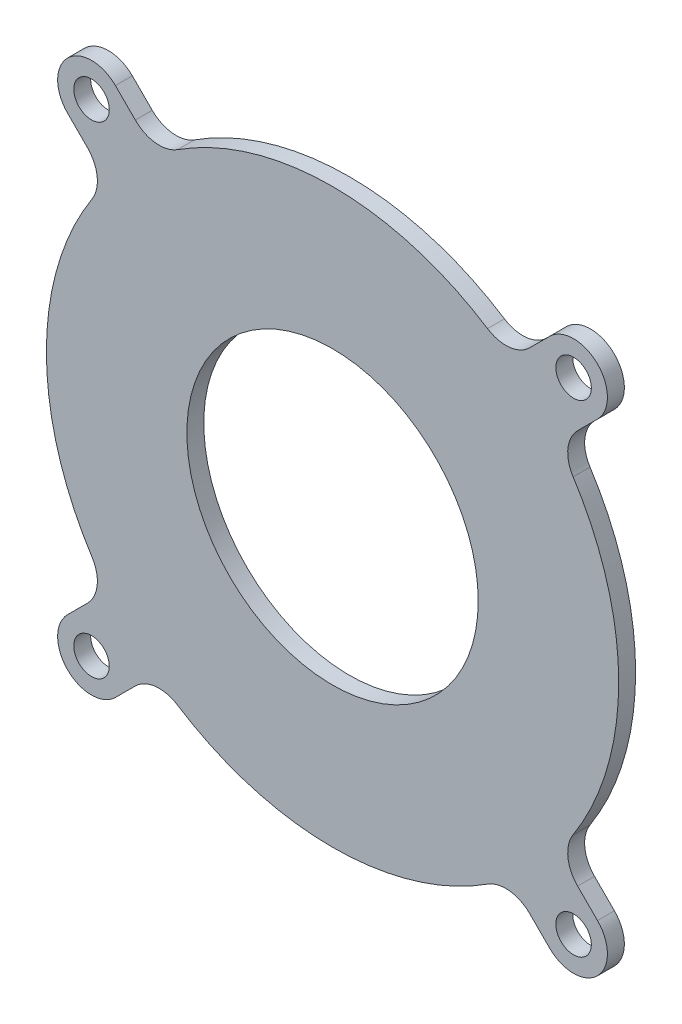
ISO-10303-21;
HEADER;
FILE_DESCRIPTION(('STEP AP214'),'2;1');
FILE_NAME('part.step','',(''),(''),'','','');
FILE_SCHEMA(('AUTOMOTIVE_DESIGN { 1 0 10303 214 1 1 1 1 }'));
ENDSEC;
DATA;
#1=APPLICATION_CONTEXT('core data for automotive mechanical design processes');
#2=APPLICATION_PROTOCOL_DEFINITION('international standard','automotive_design',2000,#1);
#3=PRODUCT_CONTEXT('',#1,'mechanical');
#4=PRODUCT('Part','Part','',(#3));
#5=PRODUCT_RELATED_PRODUCT_CATEGORY('part','',(#4));
#6=PRODUCT_DEFINITION_FORMATION('','',#4);
#7=PRODUCT_DEFINITION_CONTEXT('part definition',#1,'design');
#8=PRODUCT_DEFINITION('design','',#6,#7);
#9=PRODUCT_DEFINITION_SHAPE('','',#8);
#10=(LENGTH_UNIT() NAMED_UNIT(*) SI_UNIT(.MILLI.,.METRE.));
#11=(NAMED_UNIT(*) PLANE_ANGLE_UNIT() SI_UNIT($,.RADIAN.));
#12=(NAMED_UNIT(*) SI_UNIT($,.STERADIAN.) SOLID_ANGLE_UNIT());
#13=UNCERTAINTY_MEASURE_WITH_UNIT(LENGTH_MEASURE(1.E-05),#10,'distance_accuracy_value','');
#14=(GEOMETRIC_REPRESENTATION_CONTEXT(3) GLOBAL_UNCERTAINTY_ASSIGNED_CONTEXT((#13)) GLOBAL_UNIT_ASSIGNED_CONTEXT((#10,
#11,#12)) REPRESENTATION_CONTEXT('',''));
#15=CARTESIAN_POINT('',(0.,0.,0.));
#16=DIRECTION('',(0.,0.,1.));
#17=DIRECTION('',(1.,0.,0.));
#18=AXIS2_PLACEMENT_3D('',#15,#16,#17);
#19=CARTESIAN_POINT('',(52.049747468308,-52.0497474683077,2.));
#20=DIRECTION('',(0.,0.,1.));
#21=DIRECTION('',(1.,0.,0.));
#22=AXIS2_PLACEMENT_3D('',#19,#20,#21);
#23=PLANE('',#22);
#24=CARTESIAN_POINT('',(-4.94974746830807,4.94974746830784,2.));
#25=DIRECTION('',(0.,0.,1.));
#26=DIRECTION('',(1.,0.,0.));
#27=AXIS2_PLACEMENT_3D('',#24,#25,#26);
#28=CIRCLE('',#27,2.10000000000181);
#29=CARTESIAN_POINT('',(-2.84974746830626,4.94974746830784,2.));
#30=VERTEX_POINT('',#29);
#31=EDGE_CURVE('E528',#30,#30,#28,.T.);
#32=ORIENTED_EDGE('',*,*,#31,.F.);
#33=EDGE_LOOP('',(#32));
#34=FACE_BOUND('',#33,.T.);
#35=CARTESIAN_POINT('',(52.049747468308,-52.0497474683077,2.));
#36=DIRECTION('',(0.,0.,1.));
#37=DIRECTION('',(1.,0.,0.));
#38=AXIS2_PLACEMENT_3D('',#35,#36,#37);
#39=CIRCLE('',#38,2.0999999999985);
#40=CARTESIAN_POINT('',(54.1497474683065,-52.0497474683077,2.));
#41=VERTEX_POINT('',#40);
#42=EDGE_CURVE('E544',#41,#41,#39,.T.);
#43=ORIENTED_EDGE('',*,*,#42,.F.);
#44=EDGE_LOOP('',(#43));
#45=FACE_BOUND('',#44,.T.);
#46=CARTESIAN_POINT('',(52.049747468308,-52.0497474683077,2.));
#47=DIRECTION('',(0.,0.,1.));
#48=DIRECTION('',(1.,0.,0.));
#49=AXIS2_PLACEMENT_3D('',#46,#47,#48);
#50=CIRCLE('',#49,3.99999999998963);
#51=CARTESIAN_POINT('',(49.2213203435691,-54.8781745930466,2.));
#52=VERTEX_POINT('',#51);
#53=CARTESIAN_POINT('',(54.8781745930468,-49.2213203435689,2.));
#54=VERTEX_POINT('',#53);
#55=EDGE_CURVE('E308',#52,#54,#50,.T.);
#56=ORIENTED_EDGE('',*,*,#55,.T.);
#57=DIRECTION('',(-0.707106781186531,0.707106781186564,0.));
#58=VECTOR('',#57,1.);
#59=CARTESIAN_POINT('',(54.8781745930468,-49.2213203435689,2.));
#60=LINE('',#59,#58);
#61=CARTESIAN_POINT('',(52.526918716007,-46.870064466529,2.));
#62=VERTEX_POINT('',#61);
#63=EDGE_CURVE('E148',#54,#62,#60,.T.);
#64=ORIENTED_EDGE('',*,*,#63,.T.);
#65=CARTESIAN_POINT('',(55.3553458407532,-44.0416373417828,2.));
#66=DIRECTION('',(0.,0.,-1.));
#67=DIRECTION('',(1.,0.,0.));
#68=AXIS2_PLACEMENT_3D('',#65,#66,#67);
#69=CIRCLE('',#68,3.99999999999999);
#70=CARTESIAN_POINT('',(51.9928142334286,-41.8752160554806,2.));
#71=VERTEX_POINT('',#70);
#72=EDGE_CURVE('E393',#62,#71,#69,.T.);
#73=ORIENTED_EDGE('',*,*,#72,.T.);
#74=CARTESIAN_POINT('',(23.5499999999334,-23.5499999999476,2.));
#75=DIRECTION('',(0.,0.,1.));
#76=DIRECTION('',(1.,0.,0.));
#77=AXIS2_PLACEMENT_3D('',#74,#75,#76);
#78=CIRCLE('',#77,33.8350000000456);
#79=CARTESIAN_POINT('',(51.9928142335033,-5.22478394453042,2.));
#80=VERTEX_POINT('',#79);
#81=EDGE_CURVE('E413',#71,#80,#78,.T.);
#82=ORIENTED_EDGE('',*,*,#81,.T.);
#83=CARTESIAN_POINT('',(55.3553458408367,-3.05836265824198,2.));
#84=DIRECTION('',(0.,0.,-1.));
#85=DIRECTION('',(1.,0.,0.));
#86=AXIS2_PLACEMENT_3D('',#83,#84,#85);
#87=CIRCLE('',#86,4.);
#88=CARTESIAN_POINT('',(52.5269187160905,-0.22993553349579,2.));
#89=VERTEX_POINT('',#88);
#90=EDGE_CURVE('E409',#80,#89,#87,.T.);
#91=ORIENTED_EDGE('',*,*,#90,.T.);
#92=DIRECTION('',(0.707106781186545,0.70710678118655,0.));
#93=VECTOR('',#92,1.);
#94=CARTESIAN_POINT('',(54.8781745931514,2.12132034356506,2.));
#95=LINE('',#94,#93);
#96=CARTESIAN_POINT('',(54.8781745931516,2.12132034356488,2.));
#97=VERTEX_POINT('',#96);
#98=EDGE_CURVE('E412',#89,#97,#95,.T.);
#99=ORIENTED_EDGE('',*,*,#98,.T.);
#100=CARTESIAN_POINT('',(52.0497474684125,4.94974746830361,2.));
#101=DIRECTION('',(0.,0.,1.));
#102=DIRECTION('',(1.,0.,0.));
#103=AXIS2_PLACEMENT_3D('',#100,#101,#102);
#104=CIRCLE('',#103,3.99999999998965);
#105=CARTESIAN_POINT('',(49.2213203436736,7.7781745930428,2.));
#106=VERTEX_POINT('',#105);
#107=EDGE_CURVE('E417',#97,#106,#104,.T.);
#108=ORIENTED_EDGE('',*,*,#107,.T.);
#109=DIRECTION('',(-0.707106781186542,-0.707106781186553,0.));
#110=VECTOR('',#109,1.);
#111=CARTESIAN_POINT('',(49.2213203436736,7.7781745930428,2.));
#112=LINE('',#111,#110);
#113=CARTESIAN_POINT('',(46.8700644666735,5.42691871604261,2.));
#114=VERTEX_POINT('',#113);
#115=EDGE_CURVE('E424',#106,#114,#112,.T.);
#116=ORIENTED_EDGE('',*,*,#115,.T.);
#117=CARTESIAN_POINT('',(44.0416373419273,8.2553458407888,2.));
#118=DIRECTION('',(0.,0.,-1.));
#119=DIRECTION('',(1.,0.,0.));
#120=AXIS2_PLACEMENT_3D('',#117,#118,#119);
#121=CIRCLE('',#120,3.99999999999999);
#122=CARTESIAN_POINT('',(41.875216055624,4.89281423346494,2.));
#123=VERTEX_POINT('',#122);
#124=EDGE_CURVE('E427',#114,#123,#121,.T.);
#125=ORIENTED_EDGE('',*,*,#124,.T.);
#126=CARTESIAN_POINT('',(23.5500000000813,-23.5500000000242,2.));
#127=DIRECTION('',(0.,0.,1.));
#128=DIRECTION('',(-1.,0.,0.));
#129=AXIS2_PLACEMENT_3D('',#126,#127,#128);
#130=CIRCLE('',#129,33.8350000000457);
#131=CARTESIAN_POINT('',(5.22478394462314,4.8928142335194,2.));
#132=VERTEX_POINT('',#131);
#133=EDGE_CURVE('E430',#123,#132,#130,.T.);
#134=ORIENTED_EDGE('',*,*,#133,.T.);
#135=CARTESIAN_POINT('',(3.05836265832984,8.2553458408497,2.));
#136=DIRECTION('',(0.,0.,-1.));
#137=DIRECTION('',(1.,0.,0.));
#138=AXIS2_PLACEMENT_3D('',#135,#136,#137);
#139=CIRCLE('',#138,4.);
#140=CARTESIAN_POINT('',(0.229935533583649,5.42691871610351,2.));
#141=VERTEX_POINT('',#140);
#142=EDGE_CURVE('E433',#132,#141,#139,.T.);
#143=ORIENTED_EDGE('',*,*,#142,.T.);
#144=DIRECTION('',(-0.707106781186566,0.707106781186529,0.));
#145=VECTOR('',#144,1.);
#146=CARTESIAN_POINT('',(-2.12132034346029,7.77817459314733,2.));
#147=LINE('',#146,#145);
#148=CARTESIAN_POINT('',(-2.12132034346029,7.77817459314732,2.));
#149=VERTEX_POINT('',#148);
#150=EDGE_CURVE('E436',#141,#149,#147,.T.);
#151=ORIENTED_EDGE('',*,*,#150,.T.);
#152=CARTESIAN_POINT('',(-4.94974746819915,4.94974746840844,2.));
#153=DIRECTION('',(0.,0.,1.));
#154=DIRECTION('',(1.,0.,0.));
#155=AXIS2_PLACEMENT_3D('',#152,#153,#154);
#156=CIRCLE('',#155,3.99999999998964);
#157=CARTESIAN_POINT('',(-7.77817459293803,2.1213203436696,2.));
#158=VERTEX_POINT('',#157);
#159=EDGE_CURVE('E439',#149,#158,#156,.T.);
#160=ORIENTED_EDGE('',*,*,#159,.T.);
#161=DIRECTION('',(0.707106781186545,-0.70710678118655,0.));
#162=VECTOR('',#161,1.);
#163=CARTESIAN_POINT('',(-7.77817459293803,2.1213203436696,2.));
#164=LINE('',#163,#162);
#165=CARTESIAN_POINT('',(-5.42691871592922,-0.229935533339226,2.));
#166=VERTEX_POINT('',#165);
#167=EDGE_CURVE('E442',#158,#166,#164,.T.);
#168=ORIENTED_EDGE('',*,*,#167,.T.);
#169=CARTESIAN_POINT('',(-8.25534584067542,-3.05836265808541,2.));
#170=DIRECTION('',(0.,0.,-1.));
#171=DIRECTION('',(1.,0.,0.));
#172=AXIS2_PLACEMENT_3D('',#169,#170,#171);
#173=CIRCLE('',#172,4.);
#174=CARTESIAN_POINT('',(-4.89281423335789,-5.22478394439853,2.));
#175=VERTEX_POINT('',#174);
#176=EDGE_CURVE('E445',#166,#175,#173,.T.);
#177=ORIENTED_EDGE('',*,*,#176,.T.);
#178=CARTESIAN_POINT('',(23.55000000004,-23.5500000000001,2.));
#179=DIRECTION('',(0.,0.,1.));
#180=DIRECTION('',(1.,0.,0.));
#181=AXIS2_PLACEMENT_3D('',#178,#179,#180);
#182=CIRCLE('',#181,33.8350000000009);
#183=CARTESIAN_POINT('',(-4.89281423346648,-41.8752160554331,2.));
#184=VERTEX_POINT('',#183);
#185=EDGE_CURVE('E448',#175,#184,#182,.T.);
#186=ORIENTED_EDGE('',*,*,#185,.T.);
#187=CARTESIAN_POINT('',(-8.25534584079685,-44.0416373417262,2.));
#188=DIRECTION('',(0.,0.,-1.));
#189=DIRECTION('',(1.,0.,0.));
#190=AXIS2_PLACEMENT_3D('',#187,#188,#189);
#191=CIRCLE('',#190,4.);
#192=CARTESIAN_POINT('',(-5.42691871605065,-46.8700644664724,2.));
#193=VERTEX_POINT('',#192);
#194=EDGE_CURVE('E451',#184,#193,#191,.T.);
#195=ORIENTED_EDGE('',*,*,#194,.T.);
#196=DIRECTION('',(-0.707106781186544,-0.707106781186551,0.));
#197=VECTOR('',#196,1.);
#198=CARTESIAN_POINT('',(-7.77817459304254,-49.2213203434643,2.));
#199=LINE('',#198,#197);
#200=CARTESIAN_POINT('',(-7.77817459304274,-49.2213203434641,2.));
#201=VERTEX_POINT('',#200);
#202=EDGE_CURVE('E454',#193,#201,#199,.T.);
#203=ORIENTED_EDGE('',*,*,#202,.T.);
#204=CARTESIAN_POINT('',(-4.94974746830362,-52.0497474682028,2.));
#205=DIRECTION('',(0.,0.,1.));
#206=DIRECTION('',(1.,0.,0.));
#207=AXIS2_PLACEMENT_3D('',#204,#205,#206);
#208=CIRCLE('',#207,3.99999999998964);
#209=CARTESIAN_POINT('',(-2.1213203435648,-54.8781745929421,2.));
#210=VERTEX_POINT('',#209);
#211=EDGE_CURVE('E457',#201,#210,#208,.T.);
#212=ORIENTED_EDGE('',*,*,#211,.T.);
#213=DIRECTION('',(0.707106781186544,0.707106781186551,0.));
#214=VECTOR('',#213,1.);
#215=CARTESIAN_POINT('',(-2.1213203435648,-54.8781745929421,2.));
#216=LINE('',#215,#214);
#217=CARTESIAN_POINT('',(0.229935533390949,-52.5269187159863,2.));
#218=VERTEX_POINT('',#217);
#219=EDGE_CURVE('E460',#210,#218,#216,.T.);
#220=ORIENTED_EDGE('',*,*,#219,.T.);
#221=CARTESIAN_POINT('',(3.05836265813714,-55.3553458407325,2.));
#222=DIRECTION('',(0.,0.,-1.));
#223=DIRECTION('',(1.,0.,0.));
#224=AXIS2_PLACEMENT_3D('',#221,#222,#223);
#225=CIRCLE('',#224,3.99999999999999);
#226=CARTESIAN_POINT('',(5.22478394444227,-51.9928142334098,2.));
#227=VERTEX_POINT('',#226);
#228=EDGE_CURVE('E215',#218,#227,#225,.T.);
#229=ORIENTED_EDGE('',*,*,#228,.T.);
#230=CARTESIAN_POINT('',(23.5499999999759,-23.5499999999693,2.));
#231=DIRECTION('',(0.,0.,1.));
#232=DIRECTION('',(1.,0.,0.));
#233=AXIS2_PLACEMENT_3D('',#230,#231,#232);
#234=CIRCLE('',#233,33.8349999999999);
#235=CARTESIAN_POINT('',(41.8752160554813,-51.992814233428,2.));
#236=VERTEX_POINT('',#235);
#237=EDGE_CURVE('E209',#227,#236,#234,.T.);
#238=ORIENTED_EDGE('',*,*,#237,.T.);
#239=CARTESIAN_POINT('',(44.0416373417831,-55.3553458407528,2.));
#240=DIRECTION('',(0.,0.,-1.));
#241=DIRECTION('',(1.,0.,0.));
#242=AXIS2_PLACEMENT_3D('',#239,#240,#241);
#243=CIRCLE('',#242,4.);
#244=CARTESIAN_POINT('',(46.8700644665293,-52.5269187160066,2.));
#245=VERTEX_POINT('',#244);
#246=EDGE_CURVE('E213',#236,#245,#243,.T.);
#247=ORIENTED_EDGE('',*,*,#246,.T.);
#248=DIRECTION('',(0.707106781186534,-0.707106781186561,0.));
#249=VECTOR('',#248,1.);
#250=CARTESIAN_POINT('',(49.2213203435691,-54.8781745930466,2.));
#251=LINE('',#250,#249);
#252=EDGE_CURVE('E57',#245,#52,#251,.T.);
#253=ORIENTED_EDGE('',*,*,#252,.T.);
#254=EDGE_LOOP('',(#56,#64,#73,#82,#91,#99,#108,#116,#125,#134,#143,#151,#160,#168,#177,#186,
#195,#203,#212,#220,#229,#238,#247,#253));
#255=FACE_BOUND('',#254,.T.);
#256=CARTESIAN_POINT('',(23.5500000000813,-23.5500000000242,2.));
#257=DIRECTION('',(0.,0.,1.));
#258=DIRECTION('',(1.,0.,0.));
#259=AXIS2_PLACEMENT_3D('',#256,#257,#258);
#260=CIRCLE('',#259,17.225);
#261=CARTESIAN_POINT('',(40.7750000000813,-23.5500000000242,2.));
#262=VERTEX_POINT('',#261);
#263=EDGE_CURVE('E242',#262,#262,#260,.T.);
#264=ORIENTED_EDGE('',*,*,#263,.F.);
#265=EDGE_LOOP('',(#264));
#266=FACE_BOUND('',#265,.T.);
#267=CARTESIAN_POINT('',(-4.94974746830785,-52.0497474683081,2.));
#268=DIRECTION('',(0.,0.,1.));
#269=DIRECTION('',(1.,0.,0.));
#270=AXIS2_PLACEMENT_3D('',#267,#268,#269);
#271=CIRCLE('',#270,2.10000000000254);
#272=CARTESIAN_POINT('',(-2.84974746830531,-52.0497474683081,2.));
#273=VERTEX_POINT('',#272);
#274=EDGE_CURVE('E536',#273,#273,#271,.T.);
#275=ORIENTED_EDGE('',*,*,#274,.F.);
#276=EDGE_LOOP('',(#275));
#277=FACE_BOUND('',#276,.T.);
#278=CARTESIAN_POINT('',(52.0497474683079,4.94974746830806,2.));
#279=DIRECTION('',(0.,0.,1.));
#280=DIRECTION('',(1.,0.,0.));
#281=AXIS2_PLACEMENT_3D('',#278,#279,#280);
#282=CIRCLE('',#281,2.09999999999761);
#283=CARTESIAN_POINT('',(54.1497474683055,4.94974746830806,2.));
#284=VERTEX_POINT('',#283);
#285=EDGE_CURVE('E517',#284,#284,#282,.T.);
#286=ORIENTED_EDGE('',*,*,#285,.F.);
#287=EDGE_LOOP('',(#286));
#288=FACE_BOUND('',#287,.T.);
#289=ADVANCED_FACE('F39',(#34,#45,#255,#266,#277,#288),#23,.T.);
#290=CARTESIAN_POINT('',(52.049747468308,-52.0497474683077,0.));
#291=DIRECTION('',(0.,0.,1.));
#292=DIRECTION('',(1.,0.,0.));
#293=AXIS2_PLACEMENT_3D('',#290,#291,#292);
#294=PLANE('',#293);
#295=CARTESIAN_POINT('',(52.049747468308,-52.0497474683077,0.));
#296=DIRECTION('',(0.,0.,1.));
#297=DIRECTION('',(1.,0.,0.));
#298=AXIS2_PLACEMENT_3D('',#295,#296,#297);
#299=CIRCLE('',#298,3.99999999998963);
#300=CARTESIAN_POINT('',(49.2213203435691,-54.8781745930466,0.));
#301=VERTEX_POINT('',#300);
#302=CARTESIAN_POINT('',(54.8781745930468,-49.2213203435689,0.));
#303=VERTEX_POINT('',#302);
#304=EDGE_CURVE('E237',#301,#303,#299,.T.);
#305=ORIENTED_EDGE('',*,*,#304,.F.);
#306=DIRECTION('',(0.707106781186534,-0.707106781186561,0.));
#307=VECTOR('',#306,1.);
#308=CARTESIAN_POINT('',(49.2213203435691,-54.8781745930466,0.));
#309=LINE('',#308,#307);
#310=CARTESIAN_POINT('',(46.8700644665293,-52.5269187160066,0.));
#311=VERTEX_POINT('',#310);
#312=EDGE_CURVE('E140',#311,#301,#309,.T.);
#313=ORIENTED_EDGE('',*,*,#312,.F.);
#314=CARTESIAN_POINT('',(44.0416373417831,-55.3553458407528,0.));
#315=DIRECTION('',(0.,0.,-1.));
#316=DIRECTION('',(1.,0.,0.));
#317=AXIS2_PLACEMENT_3D('',#314,#315,#316);
#318=CIRCLE('',#317,4.);
#319=CARTESIAN_POINT('',(41.8752160554813,-51.992814233428,0.));
#320=VERTEX_POINT('',#319);
#321=EDGE_CURVE('E134',#320,#311,#318,.T.);
#322=ORIENTED_EDGE('',*,*,#321,.F.);
#323=CARTESIAN_POINT('',(23.5499999999759,-23.5499999999693,0.));
#324=DIRECTION('',(0.,0.,1.));
#325=DIRECTION('',(1.,0.,0.));
#326=AXIS2_PLACEMENT_3D('',#323,#324,#325);
#327=CIRCLE('',#326,33.8349999999999);
#328=CARTESIAN_POINT('',(5.22478394444227,-51.9928142334098,0.));
#329=VERTEX_POINT('',#328);
#330=EDGE_CURVE('E224',#329,#320,#327,.T.);
#331=ORIENTED_EDGE('',*,*,#330,.F.);
#332=CARTESIAN_POINT('',(3.05836265813714,-55.3553458407325,0.));
#333=DIRECTION('',(0.,0.,-1.));
#334=DIRECTION('',(1.,0.,0.));
#335=AXIS2_PLACEMENT_3D('',#332,#333,#334);
#336=CIRCLE('',#335,3.99999999999999);
#337=CARTESIAN_POINT('',(0.229935533390949,-52.5269187159863,0.));
#338=VERTEX_POINT('',#337);
#339=EDGE_CURVE('E299',#338,#329,#336,.T.);
#340=ORIENTED_EDGE('',*,*,#339,.F.);
#341=DIRECTION('',(0.707106781186544,0.707106781186551,0.));
#342=VECTOR('',#341,1.);
#343=CARTESIAN_POINT('',(-2.1213203435648,-54.8781745929421,0.));
#344=LINE('',#343,#342);
#345=CARTESIAN_POINT('',(-2.1213203435648,-54.8781745929421,0.));
#346=VERTEX_POINT('',#345);
#347=EDGE_CURVE('E296',#346,#338,#344,.T.);
#348=ORIENTED_EDGE('',*,*,#347,.F.);
#349=CARTESIAN_POINT('',(-4.94974746830362,-52.0497474682028,0.));
#350=DIRECTION('',(0.,0.,1.));
#351=DIRECTION('',(1.,0.,0.));
#352=AXIS2_PLACEMENT_3D('',#349,#350,#351);
#353=CIRCLE('',#352,3.99999999998964);
#354=CARTESIAN_POINT('',(-7.77817459304274,-49.2213203434641,0.));
#355=VERTEX_POINT('',#354);
#356=EDGE_CURVE('E293',#355,#346,#353,.T.);
#357=ORIENTED_EDGE('',*,*,#356,.F.);
#358=DIRECTION('',(-0.707106781186544,-0.707106781186551,0.));
#359=VECTOR('',#358,1.);
#360=CARTESIAN_POINT('',(-7.77817459304254,-49.2213203434643,0.));
#361=LINE('',#360,#359);
#362=CARTESIAN_POINT('',(-5.42691871605065,-46.8700644664724,0.));
#363=VERTEX_POINT('',#362);
#364=EDGE_CURVE('E290',#363,#355,#361,.T.);
#365=ORIENTED_EDGE('',*,*,#364,.F.);
#366=CARTESIAN_POINT('',(-8.25534584079685,-44.0416373417262,0.));
#367=DIRECTION('',(0.,0.,-1.));
#368=DIRECTION('',(1.,0.,0.));
#369=AXIS2_PLACEMENT_3D('',#366,#367,#368);
#370=CIRCLE('',#369,4.);
#371=CARTESIAN_POINT('',(-4.89281423346648,-41.8752160554331,0.));
#372=VERTEX_POINT('',#371);
#373=EDGE_CURVE('E287',#372,#363,#370,.T.);
#374=ORIENTED_EDGE('',*,*,#373,.F.);
#375=CARTESIAN_POINT('',(23.55000000004,-23.5500000000001,0.));
#376=DIRECTION('',(0.,0.,1.));
#377=DIRECTION('',(1.,0.,0.));
#378=AXIS2_PLACEMENT_3D('',#375,#376,#377);
#379=CIRCLE('',#378,33.8350000000009);
#380=CARTESIAN_POINT('',(-4.89281423335789,-5.22478394439853,0.));
#381=VERTEX_POINT('',#380);
#382=EDGE_CURVE('E284',#381,#372,#379,.T.);
#383=ORIENTED_EDGE('',*,*,#382,.F.);
#384=CARTESIAN_POINT('',(-8.25534584067542,-3.05836265808541,0.));
#385=DIRECTION('',(0.,0.,-1.));
#386=DIRECTION('',(1.,0.,0.));
#387=AXIS2_PLACEMENT_3D('',#384,#385,#386);
#388=CIRCLE('',#387,4.);
#389=CARTESIAN_POINT('',(-5.42691871592922,-0.229935533339226,0.));
#390=VERTEX_POINT('',#389);
#391=EDGE_CURVE('E281',#390,#381,#388,.T.);
#392=ORIENTED_EDGE('',*,*,#391,.F.);
#393=DIRECTION('',(0.707106781186545,-0.70710678118655,0.));
#394=VECTOR('',#393,1.);
#395=CARTESIAN_POINT('',(-7.77817459293803,2.1213203436696,0.));
#396=LINE('',#395,#394);
#397=CARTESIAN_POINT('',(-7.77817459293803,2.1213203436696,0.));
#398=VERTEX_POINT('',#397);
#399=EDGE_CURVE('E278',#398,#390,#396,.T.);
#400=ORIENTED_EDGE('',*,*,#399,.F.);
#401=CARTESIAN_POINT('',(-4.94974746819915,4.94974746840844,0.));
#402=DIRECTION('',(0.,0.,1.));
#403=DIRECTION('',(1.,0.,0.));
#404=AXIS2_PLACEMENT_3D('',#401,#402,#403);
#405=CIRCLE('',#404,3.99999999998964);
#406=CARTESIAN_POINT('',(-2.12132034346029,7.77817459314732,0.));
#407=VERTEX_POINT('',#406);
#408=EDGE_CURVE('E275',#407,#398,#405,.T.);
#409=ORIENTED_EDGE('',*,*,#408,.F.);
#410=DIRECTION('',(-0.707106781186566,0.707106781186529,0.));
#411=VECTOR('',#410,1.);
#412=CARTESIAN_POINT('',(-2.12132034346029,7.77817459314733,0.));
#413=LINE('',#412,#411);
#414=CARTESIAN_POINT('',(0.229935533583649,5.42691871610351,0.));
#415=VERTEX_POINT('',#414);
#416=EDGE_CURVE('E272',#415,#407,#413,.T.);
#417=ORIENTED_EDGE('',*,*,#416,.F.);
#418=CARTESIAN_POINT('',(3.05836265832984,8.2553458408497,0.));
#419=DIRECTION('',(0.,0.,-1.));
#420=DIRECTION('',(1.,0.,0.));
#421=AXIS2_PLACEMENT_3D('',#418,#419,#420);
#422=CIRCLE('',#421,4.);
#423=CARTESIAN_POINT('',(5.22478394462314,4.8928142335194,0.));
#424=VERTEX_POINT('',#423);
#425=EDGE_CURVE('E269',#424,#415,#422,.T.);
#426=ORIENTED_EDGE('',*,*,#425,.F.);
#427=CARTESIAN_POINT('',(23.5500000000813,-23.5500000000242,0.));
#428=DIRECTION('',(0.,0.,1.));
#429=DIRECTION('',(-1.,0.,0.));
#430=AXIS2_PLACEMENT_3D('',#427,#428,#429);
#431=CIRCLE('',#430,33.8350000000457);
#432=CARTESIAN_POINT('',(41.875216055624,4.89281423346494,0.));
#433=VERTEX_POINT('',#432);
#434=EDGE_CURVE('E266',#433,#424,#431,.T.);
#435=ORIENTED_EDGE('',*,*,#434,.F.);
#436=CARTESIAN_POINT('',(44.0416373419273,8.2553458407888,0.));
#437=DIRECTION('',(0.,0.,-1.));
#438=DIRECTION('',(1.,0.,0.));
#439=AXIS2_PLACEMENT_3D('',#436,#437,#438);
#440=CIRCLE('',#439,3.99999999999999);
#441=CARTESIAN_POINT('',(46.8700644666735,5.42691871604261,0.));
#442=VERTEX_POINT('',#441);
#443=EDGE_CURVE('E263',#442,#433,#440,.T.);
#444=ORIENTED_EDGE('',*,*,#443,.F.);
#445=DIRECTION('',(-0.707106781186542,-0.707106781186553,0.));
#446=VECTOR('',#445,1.);
#447=CARTESIAN_POINT('',(49.2213203436736,7.7781745930428,0.));
#448=LINE('',#447,#446);
#449=CARTESIAN_POINT('',(49.2213203436736,7.7781745930428,0.));
#450=VERTEX_POINT('',#449);
#451=EDGE_CURVE('E260',#450,#442,#448,.T.);
#452=ORIENTED_EDGE('',*,*,#451,.F.);
#453=CARTESIAN_POINT('',(52.0497474684125,4.94974746830361,0.));
#454=DIRECTION('',(0.,0.,1.));
#455=DIRECTION('',(1.,0.,0.));
#456=AXIS2_PLACEMENT_3D('',#453,#454,#455);
#457=CIRCLE('',#456,3.99999999998965);
#458=CARTESIAN_POINT('',(54.8781745931516,2.12132034356488,0.));
#459=VERTEX_POINT('',#458);
#460=EDGE_CURVE('E257',#459,#450,#457,.T.);
#461=ORIENTED_EDGE('',*,*,#460,.F.);
#462=DIRECTION('',(0.707106781186545,0.70710678118655,0.));
#463=VECTOR('',#462,1.);
#464=CARTESIAN_POINT('',(54.8781745931514,2.12132034356506,0.));
#465=LINE('',#464,#463);
#466=CARTESIAN_POINT('',(52.5269187160905,-0.22993553349579,0.));
#467=VERTEX_POINT('',#466);
#468=EDGE_CURVE('E254',#467,#459,#465,.T.);
#469=ORIENTED_EDGE('',*,*,#468,.F.);
#470=CARTESIAN_POINT('',(55.3553458408367,-3.05836265824198,0.));
#471=DIRECTION('',(0.,0.,-1.));
#472=DIRECTION('',(1.,0.,0.));
#473=AXIS2_PLACEMENT_3D('',#470,#471,#472);
#474=CIRCLE('',#473,4.);
#475=CARTESIAN_POINT('',(51.9928142335033,-5.22478394453042,0.));
#476=VERTEX_POINT('',#475);
#477=EDGE_CURVE('E251',#476,#467,#474,.T.);
#478=ORIENTED_EDGE('',*,*,#477,.F.);
#479=CARTESIAN_POINT('',(23.5499999999334,-23.5499999999476,0.));
#480=DIRECTION('',(0.,0.,1.));
#481=DIRECTION('',(1.,0.,0.));
#482=AXIS2_PLACEMENT_3D('',#479,#480,#481);
#483=CIRCLE('',#482,33.8350000000456);
#484=CARTESIAN_POINT('',(51.9928142334286,-41.8752160554806,0.));
#485=VERTEX_POINT('',#484);
#486=EDGE_CURVE('E248',#485,#476,#483,.T.);
#487=ORIENTED_EDGE('',*,*,#486,.F.);
#488=CARTESIAN_POINT('',(55.3553458407532,-44.0416373417828,0.));
#489=DIRECTION('',(0.,0.,-1.));
#490=DIRECTION('',(1.,0.,0.));
#491=AXIS2_PLACEMENT_3D('',#488,#489,#490);
#492=CIRCLE('',#491,3.99999999999999);
#493=CARTESIAN_POINT('',(52.526918716007,-46.870064466529,0.));
#494=VERTEX_POINT('',#493);
#495=EDGE_CURVE('E245',#494,#485,#492,.T.);
#496=ORIENTED_EDGE('',*,*,#495,.F.);
#497=DIRECTION('',(-0.707106781186531,0.707106781186564,0.));
#498=VECTOR('',#497,1.);
#499=CARTESIAN_POINT('',(54.8781745930468,-49.2213203435689,0.));
#500=LINE('',#499,#498);
#501=EDGE_CURVE('E241',#303,#494,#500,.T.);
#502=ORIENTED_EDGE('',*,*,#501,.F.);
#503=EDGE_LOOP('',(#305,#313,#322,#331,#340,#348,#357,#365,#374,#383,#392,#400,#409,#417,#426,
#435,#444,#452,#461,#469,#478,#487,#496,#502));
#504=FACE_BOUND('',#503,.T.);
#505=CARTESIAN_POINT('',(23.5500000000813,-23.5500000000242,0.));
#506=DIRECTION('',(0.,0.,1.));
#507=DIRECTION('',(1.,0.,0.));
#508=AXIS2_PLACEMENT_3D('',#505,#506,#507);
#509=CIRCLE('',#508,17.225);
#510=CARTESIAN_POINT('',(40.7750000000813,-23.5500000000242,0.));
#511=VERTEX_POINT('',#510);
#512=EDGE_CURVE('E548',#511,#511,#509,.T.);
#513=ORIENTED_EDGE('',*,*,#512,.T.);
#514=EDGE_LOOP('',(#513));
#515=FACE_BOUND('',#514,.T.);
#516=CARTESIAN_POINT('',(52.049747468308,-52.0497474683077,0.));
#517=DIRECTION('',(0.,0.,1.));
#518=DIRECTION('',(1.,0.,0.));
#519=AXIS2_PLACEMENT_3D('',#516,#517,#518);
#520=CIRCLE('',#519,2.0999999999985);
#521=CARTESIAN_POINT('',(54.1497474683065,-52.0497474683077,0.));
#522=VERTEX_POINT('',#521);
#523=EDGE_CURVE('E540',#522,#522,#520,.T.);
#524=ORIENTED_EDGE('',*,*,#523,.T.);
#525=EDGE_LOOP('',(#524));
#526=FACE_BOUND('',#525,.T.);
#527=CARTESIAN_POINT('',(-4.94974746830785,-52.0497474683081,0.));
#528=DIRECTION('',(0.,0.,1.));
#529=DIRECTION('',(1.,0.,0.));
#530=AXIS2_PLACEMENT_3D('',#527,#528,#529);
#531=CIRCLE('',#530,2.10000000000254);
#532=CARTESIAN_POINT('',(-2.84974746830531,-52.0497474683081,0.));
#533=VERTEX_POINT('',#532);
#534=EDGE_CURVE('E532',#533,#533,#531,.T.);
#535=ORIENTED_EDGE('',*,*,#534,.T.);
#536=EDGE_LOOP('',(#535));
#537=FACE_BOUND('',#536,.T.);
#538=CARTESIAN_POINT('',(-4.94974746830807,4.94974746830784,0.));
#539=DIRECTION('',(0.,0.,1.));
#540=DIRECTION('',(1.,0.,0.));
#541=AXIS2_PLACEMENT_3D('',#538,#539,#540);
#542=CIRCLE('',#541,2.10000000000181);
#543=CARTESIAN_POINT('',(-2.84974746830626,4.94974746830784,0.));
#544=VERTEX_POINT('',#543);
#545=EDGE_CURVE('E525',#544,#544,#542,.T.);
#546=ORIENTED_EDGE('',*,*,#545,.T.);
#547=EDGE_LOOP('',(#546));
#548=FACE_BOUND('',#547,.T.);
#549=CARTESIAN_POINT('',(52.0497474683079,4.94974746830806,0.));
#550=DIRECTION('',(0.,0.,1.));
#551=DIRECTION('',(1.,0.,0.));
#552=AXIS2_PLACEMENT_3D('',#549,#550,#551);
#553=CIRCLE('',#552,2.09999999999761);
#554=CARTESIAN_POINT('',(54.1497474683055,4.94974746830806,0.));
#555=VERTEX_POINT('',#554);
#556=EDGE_CURVE('E520',#555,#555,#553,.T.);
#557=ORIENTED_EDGE('',*,*,#556,.T.);
#558=EDGE_LOOP('',(#557));
#559=FACE_BOUND('',#558,.T.);
#560=ADVANCED_FACE('F397',(#504,#515,#526,#537,#548,#559),#294,.F.);
#561=CARTESIAN_POINT('',(52.049747468308,-52.0497474683077,2.));
#562=DIRECTION('',(0.,0.,-1.));
#563=DIRECTION('',(-1.,0.,0.));
#564=AXIS2_PLACEMENT_3D('',#561,#562,#563);
#565=CYLINDRICAL_SURFACE('',#564,3.99999999998963);
#566=ORIENTED_EDGE('',*,*,#304,.T.);
#567=DIRECTION('',(0.,0.,-1.));
#568=VECTOR('',#567,1.);
#569=CARTESIAN_POINT('',(54.8781745930468,-49.2213203435689,2.));
#570=LINE('',#569,#568);
#571=EDGE_CURVE('E11',#54,#303,#570,.T.);
#572=ORIENTED_EDGE('',*,*,#571,.F.);
#573=ORIENTED_EDGE('',*,*,#55,.F.);
#574=DIRECTION('',(0.,0.,-1.));
#575=VECTOR('',#574,1.);
#576=CARTESIAN_POINT('',(49.2213203435691,-54.8781745930466,2.));
#577=LINE('',#576,#575);
#578=EDGE_CURVE('E233',#52,#301,#577,.T.);
#579=ORIENTED_EDGE('',*,*,#578,.T.);
#580=EDGE_LOOP('',(#566,#572,#573,#579));
#581=FACE_BOUND('',#580,.T.);
#582=ADVANCED_FACE('F41',(#581),#565,.T.);
#583=CARTESIAN_POINT('',(54.8781745930468,-49.2213203435689,2.));
#584=DIRECTION('',(-0.707106781186564,-0.707106781186531,0.));
#585=DIRECTION('',(0.707106781186531,-0.707106781186564,0.));
#586=AXIS2_PLACEMENT_3D('',#583,#584,#585);
#587=PLANE('',#586);
#588=ORIENTED_EDGE('',*,*,#501,.T.);
#589=DIRECTION('',(0.,0.,-1.));
#590=VECTOR('',#589,1.);
#591=CARTESIAN_POINT('',(52.526918716007,-46.870064466529,2.));
#592=LINE('',#591,#590);
#593=EDGE_CURVE('E49',#62,#494,#592,.T.);
#594=ORIENTED_EDGE('',*,*,#593,.F.);
#595=ORIENTED_EDGE('',*,*,#63,.F.);
#596=ORIENTED_EDGE('',*,*,#571,.T.);
#597=EDGE_LOOP('',(#588,#594,#595,#596));
#598=FACE_BOUND('',#597,.T.);
#599=ADVANCED_FACE('F793',(#598),#587,.F.);
#600=CARTESIAN_POINT('',(55.3553458407532,-44.0416373417828,2.));
#601=DIRECTION('',(0.,0.,-1.));
#602=DIRECTION('',(-1.,0.,0.));
#603=AXIS2_PLACEMENT_3D('',#600,#601,#602);
#604=CYLINDRICAL_SURFACE('',#603,3.99999999999999);
#605=ORIENTED_EDGE('',*,*,#495,.T.);
#606=DIRECTION('',(0.,0.,-1.));
#607=VECTOR('',#606,1.);
#608=CARTESIAN_POINT('',(51.9928142334286,-41.8752160554806,2.));
#609=LINE('',#608,#607);
#610=EDGE_CURVE('E383',#71,#485,#609,.T.);
#611=ORIENTED_EDGE('',*,*,#610,.F.);
#612=ORIENTED_EDGE('',*,*,#72,.F.);
#613=ORIENTED_EDGE('',*,*,#593,.T.);
#614=EDGE_LOOP('',(#605,#611,#612,#613));
#615=FACE_BOUND('',#614,.T.);
#616=ADVANCED_FACE('F391',(#615),#604,.F.);
#617=CARTESIAN_POINT('',(23.5499999999334,-23.5499999999476,2.));
#618=DIRECTION('',(0.,0.,-1.));
#619=DIRECTION('',(-1.,0.,0.));
#620=AXIS2_PLACEMENT_3D('',#617,#618,#619);
#621=CYLINDRICAL_SURFACE('',#620,33.8350000000456);
#622=ORIENTED_EDGE('',*,*,#486,.T.);
#623=DIRECTION('',(0.,0.,-1.));
#624=VECTOR('',#623,1.);
#625=CARTESIAN_POINT('',(51.9928142335033,-5.22478394453042,2.));
#626=LINE('',#625,#624);
#627=EDGE_CURVE('E379',#80,#476,#626,.T.);
#628=ORIENTED_EDGE('',*,*,#627,.F.);
#629=ORIENTED_EDGE('',*,*,#81,.F.);
#630=ORIENTED_EDGE('',*,*,#610,.T.);
#631=EDGE_LOOP('',(#622,#628,#629,#630));
#632=FACE_BOUND('',#631,.T.);
#633=ADVANCED_FACE('F403',(#632),#621,.T.);
#634=CARTESIAN_POINT('',(55.3553458408367,-3.05836265824198,2.));
#635=DIRECTION('',(0.,0.,-1.));
#636=DIRECTION('',(-1.,0.,0.));
#637=AXIS2_PLACEMENT_3D('',#634,#635,#636);
#638=CYLINDRICAL_SURFACE('',#637,4.);
#639=ORIENTED_EDGE('',*,*,#477,.T.);
#640=DIRECTION('',(0.,0.,-1.));
#641=VECTOR('',#640,1.);
#642=CARTESIAN_POINT('',(52.5269187160905,-0.22993553349579,2.));
#643=LINE('',#642,#641);
#644=EDGE_CURVE('E375',#89,#467,#643,.T.);
#645=ORIENTED_EDGE('',*,*,#644,.F.);
#646=ORIENTED_EDGE('',*,*,#90,.F.);
#647=ORIENTED_EDGE('',*,*,#627,.T.);
#648=EDGE_LOOP('',(#639,#645,#646,#647));
#649=FACE_BOUND('',#648,.T.);
#650=ADVANCED_FACE('F407',(#649),#638,.F.);
#651=CARTESIAN_POINT('',(54.8781745931514,2.12132034356506,2.));
#652=DIRECTION('',(-0.70710678118655,0.707106781186545,0.));
#653=DIRECTION('',(-0.707106781186545,-0.70710678118655,0.));
#654=AXIS2_PLACEMENT_3D('',#651,#652,#653);
#655=PLANE('',#654);
#656=ORIENTED_EDGE('',*,*,#468,.T.);
#657=DIRECTION('',(0.,0.,-1.));
#658=VECTOR('',#657,1.);
#659=CARTESIAN_POINT('',(54.8781745931516,2.12132034356488,2.));
#660=LINE('',#659,#658);
#661=EDGE_CURVE('E371',#97,#459,#660,.T.);
#662=ORIENTED_EDGE('',*,*,#661,.F.);
#663=ORIENTED_EDGE('',*,*,#98,.F.);
#664=ORIENTED_EDGE('',*,*,#644,.T.);
#665=EDGE_LOOP('',(#656,#662,#663,#664));
#666=FACE_BOUND('',#665,.T.);
#667=ADVANCED_FACE('F758',(#666),#655,.F.);
#668=CARTESIAN_POINT('',(52.0497474684125,4.94974746830361,2.));
#669=DIRECTION('',(0.,0.,-1.));
#670=DIRECTION('',(-1.,0.,0.));
#671=AXIS2_PLACEMENT_3D('',#668,#669,#670);
#672=CYLINDRICAL_SURFACE('',#671,3.99999999998965);
#673=ORIENTED_EDGE('',*,*,#460,.T.);
#674=DIRECTION('',(0.,0.,-1.));
#675=VECTOR('',#674,1.);
#676=CARTESIAN_POINT('',(49.2213203436736,7.7781745930428,2.));
#677=LINE('',#676,#675);
#678=EDGE_CURVE('E367',#106,#450,#677,.T.);
#679=ORIENTED_EDGE('',*,*,#678,.F.);
#680=ORIENTED_EDGE('',*,*,#107,.F.);
#681=ORIENTED_EDGE('',*,*,#661,.T.);
#682=EDGE_LOOP('',(#673,#679,#680,#681));
#683=FACE_BOUND('',#682,.T.);
#684=ADVANCED_FACE('F748',(#683),#672,.T.);
#685=CARTESIAN_POINT('',(49.2213203436736,7.7781745930428,2.));
#686=DIRECTION('',(0.707106781186553,-0.707106781186542,0.));
#687=DIRECTION('',(0.707106781186542,0.707106781186553,0.));
#688=AXIS2_PLACEMENT_3D('',#685,#686,#687);
#689=PLANE('',#688);
#690=ORIENTED_EDGE('',*,*,#451,.T.);
#691=DIRECTION('',(0.,0.,-1.));
#692=VECTOR('',#691,1.);
#693=CARTESIAN_POINT('',(46.8700644666735,5.42691871604261,2.));
#694=LINE('',#693,#692);
#695=EDGE_CURVE('E363',#114,#442,#694,.T.);
#696=ORIENTED_EDGE('',*,*,#695,.F.);
#697=ORIENTED_EDGE('',*,*,#115,.F.);
#698=ORIENTED_EDGE('',*,*,#678,.T.);
#699=EDGE_LOOP('',(#690,#696,#697,#698));
#700=FACE_BOUND('',#699,.T.);
#701=ADVANCED_FACE('F738',(#700),#689,.F.);
#702=CARTESIAN_POINT('',(44.0416373419273,8.2553458407888,2.));
#703=DIRECTION('',(0.,0.,-1.));
#704=DIRECTION('',(-1.,0.,0.));
#705=AXIS2_PLACEMENT_3D('',#702,#703,#704);
#706=CYLINDRICAL_SURFACE('',#705,3.99999999999999);
#707=ORIENTED_EDGE('',*,*,#443,.T.);
#708=DIRECTION('',(0.,0.,-1.));
#709=VECTOR('',#708,1.);
#710=CARTESIAN_POINT('',(41.875216055624,4.89281423346494,2.));
#711=LINE('',#710,#709);
#712=EDGE_CURVE('E359',#123,#433,#711,.T.);
#713=ORIENTED_EDGE('',*,*,#712,.F.);
#714=ORIENTED_EDGE('',*,*,#124,.F.);
#715=ORIENTED_EDGE('',*,*,#695,.T.);
#716=EDGE_LOOP('',(#707,#713,#714,#715));
#717=FACE_BOUND('',#716,.T.);
#718=ADVANCED_FACE('F728',(#717),#706,.F.);
#719=CARTESIAN_POINT('',(23.5500000000813,-23.5500000000242,2.));
#720=DIRECTION('',(0.,0.,-1.));
#721=DIRECTION('',(-1.,0.,0.));
#722=AXIS2_PLACEMENT_3D('',#719,#720,#721);
#723=CYLINDRICAL_SURFACE('',#722,33.8350000000457);
#724=ORIENTED_EDGE('',*,*,#434,.T.);
#725=DIRECTION('',(0.,0.,-1.));
#726=VECTOR('',#725,1.);
#727=CARTESIAN_POINT('',(5.22478394462314,4.8928142335194,2.));
#728=LINE('',#727,#726);
#729=EDGE_CURVE('E355',#132,#424,#728,.T.);
#730=ORIENTED_EDGE('',*,*,#729,.F.);
#731=ORIENTED_EDGE('',*,*,#133,.F.);
#732=ORIENTED_EDGE('',*,*,#712,.T.);
#733=EDGE_LOOP('',(#724,#730,#731,#732));
#734=FACE_BOUND('',#733,.T.);
#735=ADVANCED_FACE('F718',(#734),#723,.T.);
#736=CARTESIAN_POINT('',(3.05836265832984,8.2553458408497,2.));
#737=DIRECTION('',(0.,0.,-1.));
#738=DIRECTION('',(-1.,0.,0.));
#739=AXIS2_PLACEMENT_3D('',#736,#737,#738);
#740=CYLINDRICAL_SURFACE('',#739,4.);
#741=ORIENTED_EDGE('',*,*,#425,.T.);
#742=DIRECTION('',(0.,0.,-1.));
#743=VECTOR('',#742,1.);
#744=CARTESIAN_POINT('',(0.229935533583649,5.42691871610351,2.));
#745=LINE('',#744,#743);
#746=EDGE_CURVE('E351',#141,#415,#745,.T.);
#747=ORIENTED_EDGE('',*,*,#746,.F.);
#748=ORIENTED_EDGE('',*,*,#142,.F.);
#749=ORIENTED_EDGE('',*,*,#729,.T.);
#750=EDGE_LOOP('',(#741,#747,#748,#749));
#751=FACE_BOUND('',#750,.T.);
#752=ADVANCED_FACE('F708',(#751),#740,.F.);
#753=CARTESIAN_POINT('',(-2.12132034346029,7.77817459314733,2.));
#754=DIRECTION('',(-0.707106781186529,-0.707106781186566,0.));
#755=DIRECTION('',(0.707106781186566,-0.707106781186529,0.));
#756=AXIS2_PLACEMENT_3D('',#753,#754,#755);
#757=PLANE('',#756);
#758=ORIENTED_EDGE('',*,*,#416,.T.);
#759=DIRECTION('',(0.,0.,-1.));
#760=VECTOR('',#759,1.);
#761=CARTESIAN_POINT('',(-2.12132034346029,7.77817459314732,2.));
#762=LINE('',#761,#760);
#763=EDGE_CURVE('E347',#149,#407,#762,.T.);
#764=ORIENTED_EDGE('',*,*,#763,.F.);
#765=ORIENTED_EDGE('',*,*,#150,.F.);
#766=ORIENTED_EDGE('',*,*,#746,.T.);
#767=EDGE_LOOP('',(#758,#764,#765,#766));
#768=FACE_BOUND('',#767,.T.);
#769=ADVANCED_FACE('F698',(#768),#757,.F.);
#770=CARTESIAN_POINT('',(-4.94974746819915,4.94974746840844,2.));
#771=DIRECTION('',(0.,0.,-1.));
#772=DIRECTION('',(-1.,0.,0.));
#773=AXIS2_PLACEMENT_3D('',#770,#771,#772);
#774=CYLINDRICAL_SURFACE('',#773,3.99999999998964);
#775=ORIENTED_EDGE('',*,*,#408,.T.);
#776=DIRECTION('',(0.,0.,-1.));
#777=VECTOR('',#776,1.);
#778=CARTESIAN_POINT('',(-7.77817459293803,2.1213203436696,2.));
#779=LINE('',#778,#777);
#780=EDGE_CURVE('E343',#158,#398,#779,.T.);
#781=ORIENTED_EDGE('',*,*,#780,.F.);
#782=ORIENTED_EDGE('',*,*,#159,.F.);
#783=ORIENTED_EDGE('',*,*,#763,.T.);
#784=EDGE_LOOP('',(#775,#781,#782,#783));
#785=FACE_BOUND('',#784,.T.);
#786=ADVANCED_FACE('F688',(#785),#774,.T.);
#787=CARTESIAN_POINT('',(-7.77817459293803,2.1213203436696,2.));
#788=DIRECTION('',(0.70710678118655,0.707106781186545,0.));
#789=DIRECTION('',(-0.707106781186545,0.70710678118655,0.));
#790=AXIS2_PLACEMENT_3D('',#787,#788,#789);
#791=PLANE('',#790);
#792=ORIENTED_EDGE('',*,*,#399,.T.);
#793=DIRECTION('',(0.,0.,-1.));
#794=VECTOR('',#793,1.);
#795=CARTESIAN_POINT('',(-5.42691871592922,-0.229935533339226,2.));
#796=LINE('',#795,#794);
#797=EDGE_CURVE('E339',#166,#390,#796,.T.);
#798=ORIENTED_EDGE('',*,*,#797,.F.);
#799=ORIENTED_EDGE('',*,*,#167,.F.);
#800=ORIENTED_EDGE('',*,*,#780,.T.);
#801=EDGE_LOOP('',(#792,#798,#799,#800));
#802=FACE_BOUND('',#801,.T.);
#803=ADVANCED_FACE('F678',(#802),#791,.F.);
#804=CARTESIAN_POINT('',(-8.25534584067542,-3.05836265808541,2.));
#805=DIRECTION('',(0.,0.,-1.));
#806=DIRECTION('',(-1.,0.,0.));
#807=AXIS2_PLACEMENT_3D('',#804,#805,#806);
#808=CYLINDRICAL_SURFACE('',#807,4.);
#809=ORIENTED_EDGE('',*,*,#391,.T.);
#810=DIRECTION('',(0.,0.,-1.));
#811=VECTOR('',#810,1.);
#812=CARTESIAN_POINT('',(-4.89281423335789,-5.22478394439853,2.));
#813=LINE('',#812,#811);
#814=EDGE_CURVE('E335',#175,#381,#813,.T.);
#815=ORIENTED_EDGE('',*,*,#814,.F.);
#816=ORIENTED_EDGE('',*,*,#176,.F.);
#817=ORIENTED_EDGE('',*,*,#797,.T.);
#818=EDGE_LOOP('',(#809,#815,#816,#817));
#819=FACE_BOUND('',#818,.T.);
#820=ADVANCED_FACE('F668',(#819),#808,.F.);
#821=CARTESIAN_POINT('',(23.55000000004,-23.5500000000001,2.));
#822=DIRECTION('',(0.,0.,-1.));
#823=DIRECTION('',(-1.,0.,0.));
#824=AXIS2_PLACEMENT_3D('',#821,#822,#823);
#825=CYLINDRICAL_SURFACE('',#824,33.8350000000009);
#826=ORIENTED_EDGE('',*,*,#382,.T.);
#827=DIRECTION('',(0.,0.,-1.));
#828=VECTOR('',#827,1.);
#829=CARTESIAN_POINT('',(-4.89281423346648,-41.8752160554331,2.));
#830=LINE('',#829,#828);
#831=EDGE_CURVE('E331',#184,#372,#830,.T.);
#832=ORIENTED_EDGE('',*,*,#831,.F.);
#833=ORIENTED_EDGE('',*,*,#185,.F.);
#834=ORIENTED_EDGE('',*,*,#814,.T.);
#835=EDGE_LOOP('',(#826,#832,#833,#834));
#836=FACE_BOUND('',#835,.T.);
#837=ADVANCED_FACE('F658',(#836),#825,.T.);
#838=CARTESIAN_POINT('',(-8.25534584079685,-44.0416373417262,2.));
#839=DIRECTION('',(0.,0.,-1.));
#840=DIRECTION('',(-1.,0.,0.));
#841=AXIS2_PLACEMENT_3D('',#838,#839,#840);
#842=CYLINDRICAL_SURFACE('',#841,4.);
#843=ORIENTED_EDGE('',*,*,#373,.T.);
#844=DIRECTION('',(0.,0.,-1.));
#845=VECTOR('',#844,1.);
#846=CARTESIAN_POINT('',(-5.42691871605065,-46.8700644664724,2.));
#847=LINE('',#846,#845);
#848=EDGE_CURVE('E327',#193,#363,#847,.T.);
#849=ORIENTED_EDGE('',*,*,#848,.F.);
#850=ORIENTED_EDGE('',*,*,#194,.F.);
#851=ORIENTED_EDGE('',*,*,#831,.T.);
#852=EDGE_LOOP('',(#843,#849,#850,#851));
#853=FACE_BOUND('',#852,.T.);
#854=ADVANCED_FACE('F648',(#853),#842,.F.);
#855=CARTESIAN_POINT('',(-7.77817459304254,-49.2213203434643,2.));
#856=DIRECTION('',(0.707106781186551,-0.707106781186544,0.));
#857=DIRECTION('',(0.707106781186544,0.707106781186551,0.));
#858=AXIS2_PLACEMENT_3D('',#855,#856,#857);
#859=PLANE('',#858);
#860=ORIENTED_EDGE('',*,*,#364,.T.);
#861=DIRECTION('',(0.,0.,-1.));
#862=VECTOR('',#861,1.);
#863=CARTESIAN_POINT('',(-7.77817459304274,-49.2213203434641,2.));
#864=LINE('',#863,#862);
#865=EDGE_CURVE('E323',#201,#355,#864,.T.);
#866=ORIENTED_EDGE('',*,*,#865,.F.);
#867=ORIENTED_EDGE('',*,*,#202,.F.);
#868=ORIENTED_EDGE('',*,*,#848,.T.);
#869=EDGE_LOOP('',(#860,#866,#867,#868));
#870=FACE_BOUND('',#869,.T.);
#871=ADVANCED_FACE('F638',(#870),#859,.F.);
#872=CARTESIAN_POINT('',(-4.94974746830362,-52.0497474682028,2.));
#873=DIRECTION('',(0.,0.,-1.));
#874=DIRECTION('',(-1.,0.,0.));
#875=AXIS2_PLACEMENT_3D('',#872,#873,#874);
#876=CYLINDRICAL_SURFACE('',#875,3.99999999998964);
#877=ORIENTED_EDGE('',*,*,#356,.T.);
#878=DIRECTION('',(0.,0.,-1.));
#879=VECTOR('',#878,1.);
#880=CARTESIAN_POINT('',(-2.1213203435648,-54.8781745929421,2.));
#881=LINE('',#880,#879);
#882=EDGE_CURVE('E319',#210,#346,#881,.T.);
#883=ORIENTED_EDGE('',*,*,#882,.F.);
#884=ORIENTED_EDGE('',*,*,#211,.F.);
#885=ORIENTED_EDGE('',*,*,#865,.T.);
#886=EDGE_LOOP('',(#877,#883,#884,#885));
#887=FACE_BOUND('',#886,.T.);
#888=ADVANCED_FACE('F629',(#887),#876,.T.);
#889=CARTESIAN_POINT('',(-2.1213203435648,-54.8781745929421,2.));
#890=DIRECTION('',(-0.707106781186551,0.707106781186544,0.));
#891=DIRECTION('',(-0.707106781186544,-0.707106781186551,0.));
#892=AXIS2_PLACEMENT_3D('',#889,#890,#891);
#893=PLANE('',#892);
#894=ORIENTED_EDGE('',*,*,#347,.T.);
#895=DIRECTION('',(0.,0.,-1.));
#896=VECTOR('',#895,1.);
#897=CARTESIAN_POINT('',(0.229935533390949,-52.5269187159863,2.));
#898=LINE('',#897,#896);
#899=EDGE_CURVE('E315',#218,#338,#898,.T.);
#900=ORIENTED_EDGE('',*,*,#899,.F.);
#901=ORIENTED_EDGE('',*,*,#219,.F.);
#902=ORIENTED_EDGE('',*,*,#882,.T.);
#903=EDGE_LOOP('',(#894,#900,#901,#902));
#904=FACE_BOUND('',#903,.T.);
#905=ADVANCED_FACE('F468',(#904),#893,.F.);
#906=CARTESIAN_POINT('',(3.05836265813714,-55.3553458407325,2.));
#907=DIRECTION('',(0.,0.,-1.));
#908=DIRECTION('',(-1.,0.,0.));
#909=AXIS2_PLACEMENT_3D('',#906,#907,#908);
#910=CYLINDRICAL_SURFACE('',#909,3.99999999999999);
#911=ORIENTED_EDGE('',*,*,#339,.T.);
#912=DIRECTION('',(0.,0.,-1.));
#913=VECTOR('',#912,1.);
#914=CARTESIAN_POINT('',(5.22478394444227,-51.9928142334098,2.));
#915=LINE('',#914,#913);
#916=EDGE_CURVE('E226',#227,#329,#915,.T.);
#917=ORIENTED_EDGE('',*,*,#916,.F.);
#918=ORIENTED_EDGE('',*,*,#228,.F.);
#919=ORIENTED_EDGE('',*,*,#899,.T.);
#920=EDGE_LOOP('',(#911,#917,#918,#919));
#921=FACE_BOUND('',#920,.T.);
#922=ADVANCED_FACE('F472',(#921),#910,.F.);
#923=CARTESIAN_POINT('',(23.5499999999759,-23.5499999999693,2.));
#924=DIRECTION('',(0.,0.,-1.));
#925=DIRECTION('',(-1.,0.,0.));
#926=AXIS2_PLACEMENT_3D('',#923,#924,#925);
#927=CYLINDRICAL_SURFACE('',#926,33.8349999999999);
#928=ORIENTED_EDGE('',*,*,#330,.T.);
#929=DIRECTION('',(0.,0.,-1.));
#930=VECTOR('',#929,1.);
#931=CARTESIAN_POINT('',(41.8752160554813,-51.992814233428,2.));
#932=LINE('',#931,#930);
#933=EDGE_CURVE('E221',#236,#320,#932,.T.);
#934=ORIENTED_EDGE('',*,*,#933,.F.);
#935=ORIENTED_EDGE('',*,*,#237,.F.);
#936=ORIENTED_EDGE('',*,*,#916,.T.);
#937=EDGE_LOOP('',(#928,#934,#935,#936));
#938=FACE_BOUND('',#937,.T.);
#939=ADVANCED_FACE('F222',(#938),#927,.T.);
#940=CARTESIAN_POINT('',(44.0416373417831,-55.3553458407528,2.));
#941=DIRECTION('',(0.,0.,-1.));
#942=DIRECTION('',(-1.,0.,0.));
#943=AXIS2_PLACEMENT_3D('',#940,#941,#942);
#944=CYLINDRICAL_SURFACE('',#943,4.);
#945=ORIENTED_EDGE('',*,*,#321,.T.);
#946=DIRECTION('',(0.,0.,-1.));
#947=VECTOR('',#946,1.);
#948=CARTESIAN_POINT('',(46.8700644665293,-52.5269187160066,2.));
#949=LINE('',#948,#947);
#950=EDGE_CURVE('E227',#245,#311,#949,.T.);
#951=ORIENTED_EDGE('',*,*,#950,.F.);
#952=ORIENTED_EDGE('',*,*,#246,.F.);
#953=ORIENTED_EDGE('',*,*,#933,.T.);
#954=EDGE_LOOP('',(#945,#951,#952,#953));
#955=FACE_BOUND('',#954,.T.);
#956=ADVANCED_FACE('F229',(#955),#944,.F.);
#957=CARTESIAN_POINT('',(49.2213203435691,-54.8781745930466,2.));
#958=DIRECTION('',(0.707106781186561,0.707106781186534,0.));
#959=DIRECTION('',(-0.707106781186534,0.707106781186561,0.));
#960=AXIS2_PLACEMENT_3D('',#957,#958,#959);
#961=PLANE('',#960);
#962=ORIENTED_EDGE('',*,*,#312,.T.);
#963=ORIENTED_EDGE('',*,*,#578,.F.);
#964=ORIENTED_EDGE('',*,*,#252,.F.);
#965=ORIENTED_EDGE('',*,*,#950,.T.);
#966=EDGE_LOOP('',(#962,#963,#964,#965));
#967=FACE_BOUND('',#966,.T.);
#968=ADVANCED_FACE('F476',(#967),#961,.F.);
#969=CARTESIAN_POINT('',(23.5500000000813,-23.5500000000242,2.));
#970=DIRECTION('',(0.,0.,-1.));
#971=DIRECTION('',(-1.,0.,0.));
#972=AXIS2_PLACEMENT_3D('',#969,#970,#971);
#973=CYLINDRICAL_SURFACE('',#972,17.225);
#974=ORIENTED_EDGE('',*,*,#263,.T.);
#975=EDGE_LOOP('',(#974));
#976=FACE_BOUND('',#975,.T.);
#977=ORIENTED_EDGE('',*,*,#512,.F.);
#978=EDGE_LOOP('',(#977));
#979=FACE_BOUND('',#978,.T.);
#980=ADVANCED_FACE('F478',(#976,#979),#973,.F.);
#981=CARTESIAN_POINT('',(52.049747468308,-52.0497474683077,2.));
#982=DIRECTION('',(0.,0.,-1.));
#983=DIRECTION('',(-1.,0.,0.));
#984=AXIS2_PLACEMENT_3D('',#981,#982,#983);
#985=CYLINDRICAL_SURFACE('',#984,2.0999999999985);
#986=ORIENTED_EDGE('',*,*,#42,.T.);
#987=EDGE_LOOP('',(#986));
#988=FACE_BOUND('',#987,.T.);
#989=ORIENTED_EDGE('',*,*,#523,.F.);
#990=EDGE_LOOP('',(#989));
#991=FACE_BOUND('',#990,.T.);
#992=ADVANCED_FACE('F484',(#988,#991),#985,.F.);
#993=CARTESIAN_POINT('',(-4.94974746830785,-52.0497474683081,2.));
#994=DIRECTION('',(0.,0.,-1.));
#995=DIRECTION('',(-1.,0.,0.));
#996=AXIS2_PLACEMENT_3D('',#993,#994,#995);
#997=CYLINDRICAL_SURFACE('',#996,2.10000000000254);
#998=ORIENTED_EDGE('',*,*,#274,.T.);
#999=EDGE_LOOP('',(#998));
#1000=FACE_BOUND('',#999,.T.);
#1001=ORIENTED_EDGE('',*,*,#534,.F.);
#1002=EDGE_LOOP('',(#1001));
#1003=FACE_BOUND('',#1002,.T.);
#1004=ADVANCED_FACE('F500',(#1000,#1003),#997,.F.);
#1005=CARTESIAN_POINT('',(-4.94974746830807,4.94974746830784,2.));
#1006=DIRECTION('',(0.,0.,-1.));
#1007=DIRECTION('',(-1.,0.,0.));
#1008=AXIS2_PLACEMENT_3D('',#1005,#1006,#1007);
#1009=CYLINDRICAL_SURFACE('',#1008,2.10000000000181);
#1010=ORIENTED_EDGE('',*,*,#31,.T.);
#1011=EDGE_LOOP('',(#1010));
#1012=FACE_BOUND('',#1011,.T.);
#1013=ORIENTED_EDGE('',*,*,#545,.F.);
#1014=EDGE_LOOP('',(#1013));
#1015=FACE_BOUND('',#1014,.T.);
#1016=ADVANCED_FACE('F504',(#1012,#1015),#1009,.F.);
#1017=CARTESIAN_POINT('',(52.0497474683079,4.94974746830806,2.));
#1018=DIRECTION('',(0.,0.,-1.));
#1019=DIRECTION('',(-1.,0.,0.));
#1020=AXIS2_PLACEMENT_3D('',#1017,#1018,#1019);
#1021=CYLINDRICAL_SURFACE('',#1020,2.09999999999761);
#1022=ORIENTED_EDGE('',*,*,#285,.T.);
#1023=EDGE_LOOP('',(#1022));
#1024=FACE_BOUND('',#1023,.T.);
#1025=ORIENTED_EDGE('',*,*,#556,.F.);
#1026=EDGE_LOOP('',(#1025));
#1027=FACE_BOUND('',#1026,.T.);
#1028=ADVANCED_FACE('F508',(#1024,#1027),#1021,.F.);
#1029=CLOSED_SHELL('',(#289,#560,#582,#599,#616,#633,#650,#667,#684,#701,#718,#735,#752,#769,
#786,#803,#820,#837,#854,#871,#888,#905,#922,#939,#956,#968,#980,#992,#1004,#1016,#1028));
#1030=MANIFOLD_SOLID_BREP('B2',#1029);
#1031=ADVANCED_BREP_SHAPE_REPRESENTATION('',(#18,#1030),#14);
#1032=SHAPE_DEFINITION_REPRESENTATION(#9,#1031);
ENDSEC;
END-ISO-10303-21;
